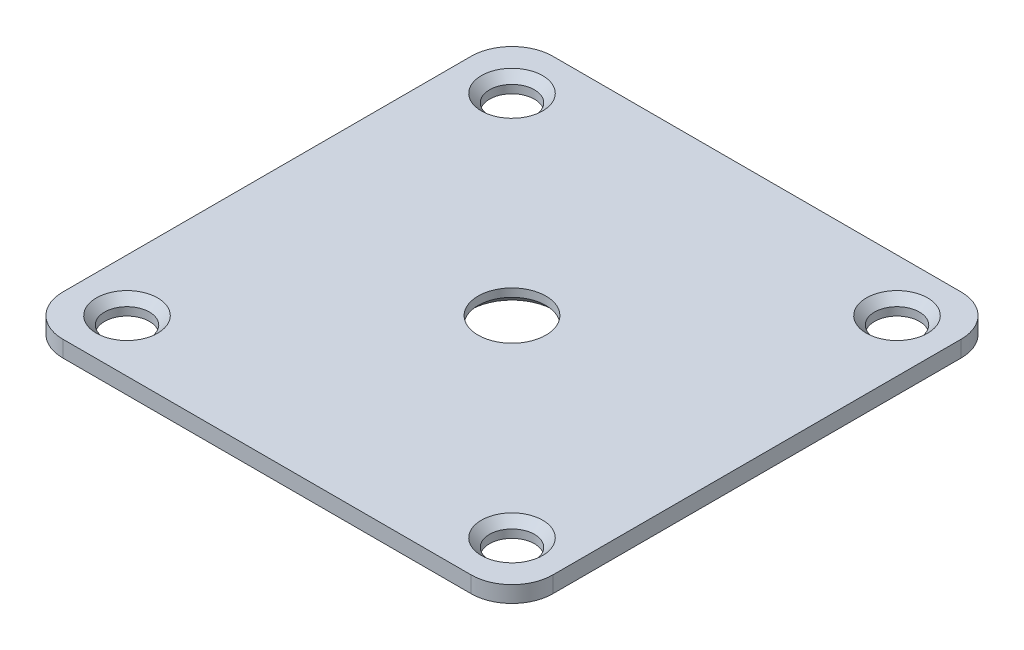
ISO-10303-21;
HEADER;
FILE_DESCRIPTION(('STEP AP214'),'2;1');
FILE_NAME('part.step','',(''),(''),'','','');
FILE_SCHEMA(('AUTOMOTIVE_DESIGN { 1 0 10303 214 1 1 1 1 }'));
ENDSEC;
DATA;
#1=APPLICATION_CONTEXT('core data for automotive mechanical design processes');
#2=APPLICATION_PROTOCOL_DEFINITION('international standard','automotive_design',2000,#1);
#3=PRODUCT_CONTEXT('',#1,'mechanical');
#4=PRODUCT('Part','Part','',(#3));
#5=PRODUCT_RELATED_PRODUCT_CATEGORY('part','',(#4));
#6=PRODUCT_DEFINITION_FORMATION('','',#4);
#7=PRODUCT_DEFINITION_CONTEXT('part definition',#1,'design');
#8=PRODUCT_DEFINITION('design','',#6,#7);
#9=PRODUCT_DEFINITION_SHAPE('','',#8);
#10=(LENGTH_UNIT() NAMED_UNIT(*) SI_UNIT(.MILLI.,.METRE.));
#11=(NAMED_UNIT(*) PLANE_ANGLE_UNIT() SI_UNIT($,.RADIAN.));
#12=(NAMED_UNIT(*) SI_UNIT($,.STERADIAN.) SOLID_ANGLE_UNIT());
#13=UNCERTAINTY_MEASURE_WITH_UNIT(LENGTH_MEASURE(1.E-05),#10,'distance_accuracy_value','');
#14=(GEOMETRIC_REPRESENTATION_CONTEXT(3) GLOBAL_UNCERTAINTY_ASSIGNED_CONTEXT((#13)) GLOBAL_UNIT_ASSIGNED_CONTEXT((#10,
#11,#12)) REPRESENTATION_CONTEXT('',''));
#15=CARTESIAN_POINT('',(0.,0.,0.));
#16=DIRECTION('',(0.,0.,1.));
#17=DIRECTION('',(1.,0.,0.));
#18=AXIS2_PLACEMENT_3D('',#15,#16,#17);
#19=CARTESIAN_POINT('',(30.,2.,0.));
#20=DIRECTION('',(1.,0.,0.));
#21=DIRECTION('',(0.,0.,-1.));
#22=AXIS2_PLACEMENT_3D('',#19,#20,#21);
#23=PLANE('',#22);
#24=DIRECTION('',(0.,0.,1.));
#25=VECTOR('',#24,1.);
#26=CARTESIAN_POINT('',(30.,0.,0.));
#27=LINE('',#26,#25);
#28=CARTESIAN_POINT('',(30.,0.,-25.));
#29=VERTEX_POINT('',#28);
#30=CARTESIAN_POINT('',(30.,0.,25.));
#31=VERTEX_POINT('',#30);
#32=EDGE_CURVE('E140',#29,#31,#27,.T.);
#33=ORIENTED_EDGE('',*,*,#32,.F.);
#34=DIRECTION('',(0.,-1.,0.));
#35=VECTOR('',#34,1.);
#36=CARTESIAN_POINT('',(30.,2.,-25.));
#37=LINE('',#36,#35);
#38=CARTESIAN_POINT('',(30.,2.,-25.));
#39=VERTEX_POINT('',#38);
#40=EDGE_CURVE('E192',#29,#39,#37,.F.);
#41=ORIENTED_EDGE('',*,*,#40,.T.);
#42=DIRECTION('',(0.,0.,1.));
#43=VECTOR('',#42,1.);
#44=CARTESIAN_POINT('',(30.,2.,0.));
#45=LINE('',#44,#43);
#46=CARTESIAN_POINT('',(30.,2.,25.));
#47=VERTEX_POINT('',#46);
#48=EDGE_CURVE('E198',#39,#47,#45,.T.);
#49=ORIENTED_EDGE('',*,*,#48,.T.);
#50=DIRECTION('',(0.,-1.,0.));
#51=VECTOR('',#50,1.);
#52=CARTESIAN_POINT('',(30.,0.,25.));
#53=LINE('',#52,#51);
#54=EDGE_CURVE('E189',#47,#31,#53,.T.);
#55=ORIENTED_EDGE('',*,*,#54,.T.);
#56=EDGE_LOOP('',(#33,#41,#49,#55));
#57=FACE_BOUND('',#56,.T.);
#58=ADVANCED_FACE('F43',(#57),#23,.T.);
#59=CARTESIAN_POINT('',(0.,2.,-30.));
#60=DIRECTION('',(0.,0.,-1.));
#61=DIRECTION('',(-1.,0.,0.));
#62=AXIS2_PLACEMENT_3D('',#59,#60,#61);
#63=PLANE('',#62);
#64=DIRECTION('',(1.,0.,0.));
#65=VECTOR('',#64,1.);
#66=CARTESIAN_POINT('',(0.,0.,-30.));
#67=LINE('',#66,#65);
#68=CARTESIAN_POINT('',(-25.,0.,-30.));
#69=VERTEX_POINT('',#68);
#70=CARTESIAN_POINT('',(25.,0.,-30.));
#71=VERTEX_POINT('',#70);
#72=EDGE_CURVE('E136',#69,#71,#67,.T.);
#73=ORIENTED_EDGE('',*,*,#72,.F.);
#74=DIRECTION('',(0.,-1.,0.));
#75=VECTOR('',#74,1.);
#76=CARTESIAN_POINT('',(-25.,2.,-30.));
#77=LINE('',#76,#75);
#78=CARTESIAN_POINT('',(-25.,2.,-30.));
#79=VERTEX_POINT('',#78);
#80=EDGE_CURVE('E114',#69,#79,#77,.F.);
#81=ORIENTED_EDGE('',*,*,#80,.T.);
#82=DIRECTION('',(1.,0.,0.));
#83=VECTOR('',#82,1.);
#84=CARTESIAN_POINT('',(0.,2.,-30.));
#85=LINE('',#84,#83);
#86=CARTESIAN_POINT('',(25.,2.,-30.));
#87=VERTEX_POINT('',#86);
#88=EDGE_CURVE('E207',#79,#87,#85,.T.);
#89=ORIENTED_EDGE('',*,*,#88,.T.);
#90=DIRECTION('',(0.,-1.,0.));
#91=VECTOR('',#90,1.);
#92=CARTESIAN_POINT('',(25.,2.,-30.));
#93=LINE('',#92,#91);
#94=EDGE_CURVE('E119',#87,#71,#93,.T.);
#95=ORIENTED_EDGE('',*,*,#94,.T.);
#96=EDGE_LOOP('',(#73,#81,#89,#95));
#97=FACE_BOUND('',#96,.T.);
#98=ADVANCED_FACE('F212',(#97),#63,.T.);
#99=CARTESIAN_POINT('',(-30.,2.,0.));
#100=DIRECTION('',(1.,0.,0.));
#101=DIRECTION('',(0.,0.,-1.));
#102=AXIS2_PLACEMENT_3D('',#99,#100,#101);
#103=PLANE('',#102);
#104=DIRECTION('',(0.,0.,1.));
#105=VECTOR('',#104,1.);
#106=CARTESIAN_POINT('',(-30.,2.,0.));
#107=LINE('',#106,#105);
#108=CARTESIAN_POINT('',(-30.,2.,-25.));
#109=VERTEX_POINT('',#108);
#110=CARTESIAN_POINT('',(-30.,2.,25.));
#111=VERTEX_POINT('',#110);
#112=EDGE_CURVE('E128',#109,#111,#107,.T.);
#113=ORIENTED_EDGE('',*,*,#112,.F.);
#114=DIRECTION('',(0.,-1.,0.));
#115=VECTOR('',#114,1.);
#116=CARTESIAN_POINT('',(-30.,0.,-25.));
#117=LINE('',#116,#115);
#118=CARTESIAN_POINT('',(-30.,0.,-25.));
#119=VERTEX_POINT('',#118);
#120=EDGE_CURVE('E113',#109,#119,#117,.T.);
#121=ORIENTED_EDGE('',*,*,#120,.T.);
#122=DIRECTION('',(0.,0.,1.));
#123=VECTOR('',#122,1.);
#124=CARTESIAN_POINT('',(-30.,0.,0.));
#125=LINE('',#124,#123);
#126=CARTESIAN_POINT('',(-30.,0.,25.));
#127=VERTEX_POINT('',#126);
#128=EDGE_CURVE('E126',#119,#127,#125,.T.);
#129=ORIENTED_EDGE('',*,*,#128,.T.);
#130=DIRECTION('',(0.,-1.,0.));
#131=VECTOR('',#130,1.);
#132=CARTESIAN_POINT('',(-30.,2.,25.));
#133=LINE('',#132,#131);
#134=EDGE_CURVE('E130',#127,#111,#133,.F.);
#135=ORIENTED_EDGE('',*,*,#134,.T.);
#136=EDGE_LOOP('',(#113,#121,#129,#135));
#137=FACE_BOUND('',#136,.T.);
#138=ADVANCED_FACE('F125',(#137),#103,.F.);
#139=CARTESIAN_POINT('',(0.,2.,0.));
#140=DIRECTION('',(0.,-1.,0.));
#141=DIRECTION('',(0.,0.,-1.));
#142=AXIS2_PLACEMENT_3D('',#139,#140,#141);
#143=CYLINDRICAL_SURFACE('',#142,4.15000000000004);
#144=CARTESIAN_POINT('',(0.,1.,0.));
#145=DIRECTION('',(0.,1.,0.));
#146=DIRECTION('',(0.,0.,1.));
#147=AXIS2_PLACEMENT_3D('',#144,#145,#146);
#148=CIRCLE('',#147,4.15000000000004);
#149=CARTESIAN_POINT('',(0.,1.,4.15000000000002));
#150=VERTEX_POINT('',#149);
#151=EDGE_CURVE('E172',#150,#150,#148,.F.);
#152=ORIENTED_EDGE('',*,*,#151,.T.);
#153=EDGE_LOOP('',(#152));
#154=FACE_BOUND('',#153,.T.);
#155=CARTESIAN_POINT('',(0.,2.,0.));
#156=DIRECTION('',(0.,1.,0.));
#157=DIRECTION('',(0.,0.,1.));
#158=AXIS2_PLACEMENT_3D('',#155,#156,#157);
#159=CIRCLE('',#158,4.15000000000004);
#160=CARTESIAN_POINT('',(0.,2.,4.15000000000002));
#161=VERTEX_POINT('',#160);
#162=EDGE_CURVE('E138',#161,#161,#159,.T.);
#163=ORIENTED_EDGE('',*,*,#162,.T.);
#164=EDGE_LOOP('',(#163));
#165=FACE_BOUND('',#164,.T.);
#166=ADVANCED_FACE('F232',(#154,#165),#143,.F.);
#167=CARTESIAN_POINT('',(23.57,2.,-23.57));
#168=DIRECTION('',(0.,-1.,0.));
#169=DIRECTION('',(0.,0.,-1.));
#170=AXIS2_PLACEMENT_3D('',#167,#168,#169);
#171=CYLINDRICAL_SURFACE('',#170,2.75);
#172=CARTESIAN_POINT('',(23.57,0.999999999999992,-23.57));
#173=DIRECTION('',(0.,1.,0.));
#174=DIRECTION('',(0.,0.,1.));
#175=AXIS2_PLACEMENT_3D('',#172,#173,#174);
#176=CIRCLE('',#175,2.75);
#177=CARTESIAN_POINT('',(23.57,0.999999999999992,-20.82));
#178=VERTEX_POINT('',#177);
#179=EDGE_CURVE('E144',#178,#178,#176,.T.);
#180=ORIENTED_EDGE('',*,*,#179,.T.);
#181=EDGE_LOOP('',(#180));
#182=FACE_BOUND('',#181,.T.);
#183=CARTESIAN_POINT('',(23.57,0.,-23.57));
#184=DIRECTION('',(0.,1.,0.));
#185=DIRECTION('',(0.,0.,1.));
#186=AXIS2_PLACEMENT_3D('',#183,#184,#185);
#187=CIRCLE('',#186,2.75);
#188=CARTESIAN_POINT('',(23.57,0.,-20.82));
#189=VERTEX_POINT('',#188);
#190=EDGE_CURVE('E213',#189,#189,#187,.T.);
#191=ORIENTED_EDGE('',*,*,#190,.F.);
#192=EDGE_LOOP('',(#191));
#193=FACE_BOUND('',#192,.T.);
#194=ADVANCED_FACE('F259',(#182,#193),#171,.F.);
#195=CARTESIAN_POINT('',(-23.57,2.,-23.57));
#196=DIRECTION('',(0.,-1.,0.));
#197=DIRECTION('',(0.,0.,-1.));
#198=AXIS2_PLACEMENT_3D('',#195,#196,#197);
#199=CYLINDRICAL_SURFACE('',#198,2.75);
#200=CARTESIAN_POINT('',(-23.57,0.999999999999992,-23.57));
#201=DIRECTION('',(0.,1.,0.));
#202=DIRECTION('',(0.,0.,1.));
#203=AXIS2_PLACEMENT_3D('',#200,#201,#202);
#204=CIRCLE('',#203,2.75);
#205=CARTESIAN_POINT('',(-23.57,0.999999999999992,-20.82));
#206=VERTEX_POINT('',#205);
#207=EDGE_CURVE('E166',#206,#206,#204,.T.);
#208=ORIENTED_EDGE('',*,*,#207,.T.);
#209=EDGE_LOOP('',(#208));
#210=FACE_BOUND('',#209,.T.);
#211=CARTESIAN_POINT('',(-23.57,0.,-23.57));
#212=DIRECTION('',(0.,1.,0.));
#213=DIRECTION('',(0.,0.,1.));
#214=AXIS2_PLACEMENT_3D('',#211,#212,#213);
#215=CIRCLE('',#214,2.75);
#216=CARTESIAN_POINT('',(-23.57,0.,-20.82));
#217=VERTEX_POINT('',#216);
#218=EDGE_CURVE('E215',#217,#217,#215,.T.);
#219=ORIENTED_EDGE('',*,*,#218,.F.);
#220=EDGE_LOOP('',(#219));
#221=FACE_BOUND('',#220,.T.);
#222=ADVANCED_FACE('F263',(#210,#221),#199,.F.);
#223=CARTESIAN_POINT('',(-23.57,2.,23.57));
#224=DIRECTION('',(0.,-1.,0.));
#225=DIRECTION('',(0.,0.,-1.));
#226=AXIS2_PLACEMENT_3D('',#223,#224,#225);
#227=CYLINDRICAL_SURFACE('',#226,2.75);
#228=CARTESIAN_POINT('',(-23.57,0.999999999999992,23.57));
#229=DIRECTION('',(0.,1.,0.));
#230=DIRECTION('',(0.,0.,1.));
#231=AXIS2_PLACEMENT_3D('',#228,#229,#230);
#232=CIRCLE('',#231,2.75);
#233=CARTESIAN_POINT('',(-23.57,0.999999999999992,26.32));
#234=VERTEX_POINT('',#233);
#235=EDGE_CURVE('E163',#234,#234,#232,.T.);
#236=ORIENTED_EDGE('',*,*,#235,.T.);
#237=EDGE_LOOP('',(#236));
#238=FACE_BOUND('',#237,.T.);
#239=CARTESIAN_POINT('',(-23.57,0.,23.57));
#240=DIRECTION('',(0.,1.,0.));
#241=DIRECTION('',(0.,0.,1.));
#242=AXIS2_PLACEMENT_3D('',#239,#240,#241);
#243=CIRCLE('',#242,2.75);
#244=CARTESIAN_POINT('',(-23.57,0.,26.32));
#245=VERTEX_POINT('',#244);
#246=EDGE_CURVE('E220',#245,#245,#243,.T.);
#247=ORIENTED_EDGE('',*,*,#246,.F.);
#248=EDGE_LOOP('',(#247));
#249=FACE_BOUND('',#248,.T.);
#250=ADVANCED_FACE('F267',(#238,#249),#227,.F.);
#251=CARTESIAN_POINT('',(23.57,2.,23.57));
#252=DIRECTION('',(0.,-1.,0.));
#253=DIRECTION('',(0.,0.,-1.));
#254=AXIS2_PLACEMENT_3D('',#251,#252,#253);
#255=CYLINDRICAL_SURFACE('',#254,2.75);
#256=CARTESIAN_POINT('',(23.57,0.999999999999992,23.57));
#257=DIRECTION('',(0.,1.,0.));
#258=DIRECTION('',(0.,0.,1.));
#259=AXIS2_PLACEMENT_3D('',#256,#257,#258);
#260=CIRCLE('',#259,2.75);
#261=CARTESIAN_POINT('',(23.57,0.999999999999992,26.32));
#262=VERTEX_POINT('',#261);
#263=EDGE_CURVE('E160',#262,#262,#260,.T.);
#264=ORIENTED_EDGE('',*,*,#263,.T.);
#265=EDGE_LOOP('',(#264));
#266=FACE_BOUND('',#265,.T.);
#267=CARTESIAN_POINT('',(23.57,0.,23.57));
#268=DIRECTION('',(0.,1.,0.));
#269=DIRECTION('',(0.,0.,1.));
#270=AXIS2_PLACEMENT_3D('',#267,#268,#269);
#271=CIRCLE('',#270,2.75);
#272=CARTESIAN_POINT('',(23.57,0.,26.32));
#273=VERTEX_POINT('',#272);
#274=EDGE_CURVE('E223',#273,#273,#271,.T.);
#275=ORIENTED_EDGE('',*,*,#274,.F.);
#276=EDGE_LOOP('',(#275));
#277=FACE_BOUND('',#276,.T.);
#278=ADVANCED_FACE('F245',(#266,#277),#255,.F.);
#279=CARTESIAN_POINT('',(0.,2.,30.));
#280=DIRECTION('',(0.,0.,-1.));
#281=DIRECTION('',(-1.,0.,0.));
#282=AXIS2_PLACEMENT_3D('',#279,#280,#281);
#283=PLANE('',#282);
#284=DIRECTION('',(1.,0.,0.));
#285=VECTOR('',#284,1.);
#286=CARTESIAN_POINT('',(0.,2.,30.));
#287=LINE('',#286,#285);
#288=CARTESIAN_POINT('',(-25.,2.,30.));
#289=VERTEX_POINT('',#288);
#290=CARTESIAN_POINT('',(25.,2.,30.));
#291=VERTEX_POINT('',#290);
#292=EDGE_CURVE('E148',#289,#291,#287,.T.);
#293=ORIENTED_EDGE('',*,*,#292,.F.);
#294=DIRECTION('',(0.,-1.,0.));
#295=VECTOR('',#294,1.);
#296=CARTESIAN_POINT('',(-25.,2.,30.));
#297=LINE('',#296,#295);
#298=CARTESIAN_POINT('',(-25.,0.,30.));
#299=VERTEX_POINT('',#298);
#300=EDGE_CURVE('E11',#289,#299,#297,.T.);
#301=ORIENTED_EDGE('',*,*,#300,.T.);
#302=DIRECTION('',(1.,0.,0.));
#303=VECTOR('',#302,1.);
#304=CARTESIAN_POINT('',(0.,0.,30.));
#305=LINE('',#304,#303);
#306=CARTESIAN_POINT('',(25.,0.,30.));
#307=VERTEX_POINT('',#306);
#308=EDGE_CURVE('E135',#299,#307,#305,.T.);
#309=ORIENTED_EDGE('',*,*,#308,.T.);
#310=DIRECTION('',(0.,-1.,0.));
#311=VECTOR('',#310,1.);
#312=CARTESIAN_POINT('',(25.,2.,30.));
#313=LINE('',#312,#311);
#314=EDGE_CURVE('E51',#307,#291,#313,.F.);
#315=ORIENTED_EDGE('',*,*,#314,.T.);
#316=EDGE_LOOP('',(#293,#301,#309,#315));
#317=FACE_BOUND('',#316,.T.);
#318=ADVANCED_FACE('F235',(#317),#283,.F.);
#319=CARTESIAN_POINT('',(0.,2.,0.));
#320=DIRECTION('',(0.,1.,0.));
#321=DIRECTION('',(0.,0.,1.));
#322=AXIS2_PLACEMENT_3D('',#319,#320,#321);
#323=PLANE('',#322);
#324=CARTESIAN_POINT('',(23.57,2.,-23.57));
#325=DIRECTION('',(0.,1.,0.));
#326=DIRECTION('',(0.,0.,1.));
#327=AXIS2_PLACEMENT_3D('',#324,#325,#326);
#328=CIRCLE('',#327,3.75000000000001);
#329=CARTESIAN_POINT('',(23.57,2.,-19.82));
#330=VERTEX_POINT('',#329);
#331=EDGE_CURVE('E157',#330,#330,#328,.F.);
#332=ORIENTED_EDGE('',*,*,#331,.T.);
#333=EDGE_LOOP('',(#332));
#334=FACE_BOUND('',#333,.T.);
#335=CARTESIAN_POINT('',(23.57,2.,23.57));
#336=DIRECTION('',(0.,1.,0.));
#337=DIRECTION('',(0.,0.,1.));
#338=AXIS2_PLACEMENT_3D('',#335,#336,#337);
#339=CIRCLE('',#338,3.75000000000001);
#340=CARTESIAN_POINT('',(23.57,2.,27.32));
#341=VERTEX_POINT('',#340);
#342=EDGE_CURVE('E154',#341,#341,#339,.F.);
#343=ORIENTED_EDGE('',*,*,#342,.T.);
#344=EDGE_LOOP('',(#343));
#345=FACE_BOUND('',#344,.T.);
#346=CARTESIAN_POINT('',(-23.57,2.,23.57));
#347=DIRECTION('',(0.,1.,0.));
#348=DIRECTION('',(0.,0.,1.));
#349=AXIS2_PLACEMENT_3D('',#346,#347,#348);
#350=CIRCLE('',#349,3.75000000000001);
#351=CARTESIAN_POINT('',(-23.57,2.,27.32));
#352=VERTEX_POINT('',#351);
#353=EDGE_CURVE('E151',#352,#352,#350,.F.);
#354=ORIENTED_EDGE('',*,*,#353,.T.);
#355=EDGE_LOOP('',(#354));
#356=FACE_BOUND('',#355,.T.);
#357=CARTESIAN_POINT('',(-23.57,2.,-23.57));
#358=DIRECTION('',(0.,1.,0.));
#359=DIRECTION('',(0.,0.,1.));
#360=AXIS2_PLACEMENT_3D('',#357,#358,#359);
#361=CIRCLE('',#360,3.75000000000001);
#362=CARTESIAN_POINT('',(-23.57,2.,-19.82));
#363=VERTEX_POINT('',#362);
#364=EDGE_CURVE('E147',#363,#363,#361,.F.);
#365=ORIENTED_EDGE('',*,*,#364,.T.);
#366=EDGE_LOOP('',(#365));
#367=FACE_BOUND('',#366,.T.);
#368=ORIENTED_EDGE('',*,*,#162,.F.);
#369=EDGE_LOOP('',(#368));
#370=FACE_BOUND('',#369,.T.);
#371=ORIENTED_EDGE('',*,*,#88,.F.);
#372=CARTESIAN_POINT('',(-25.,2.,-25.));
#373=DIRECTION('',(0.,1.,0.));
#374=DIRECTION('',(0.,0.,1.));
#375=AXIS2_PLACEMENT_3D('',#372,#373,#374);
#376=CIRCLE('',#375,5.);
#377=EDGE_CURVE('E187',#79,#109,#376,.T.);
#378=ORIENTED_EDGE('',*,*,#377,.T.);
#379=ORIENTED_EDGE('',*,*,#112,.T.);
#380=CARTESIAN_POINT('',(-25.,2.,25.));
#381=DIRECTION('',(0.,1.,0.));
#382=DIRECTION('',(0.,0.,1.));
#383=AXIS2_PLACEMENT_3D('',#380,#381,#382);
#384=CIRCLE('',#383,5.);
#385=EDGE_CURVE('E64',#111,#289,#384,.T.);
#386=ORIENTED_EDGE('',*,*,#385,.T.);
#387=ORIENTED_EDGE('',*,*,#292,.T.);
#388=CARTESIAN_POINT('',(25.,2.,25.));
#389=DIRECTION('',(0.,1.,0.));
#390=DIRECTION('',(0.,0.,1.));
#391=AXIS2_PLACEMENT_3D('',#388,#389,#390);
#392=CIRCLE('',#391,5.);
#393=EDGE_CURVE('E182',#291,#47,#392,.T.);
#394=ORIENTED_EDGE('',*,*,#393,.T.);
#395=ORIENTED_EDGE('',*,*,#48,.F.);
#396=CARTESIAN_POINT('',(25.,2.,-25.));
#397=DIRECTION('',(0.,1.,0.));
#398=DIRECTION('',(0.,0.,1.));
#399=AXIS2_PLACEMENT_3D('',#396,#397,#398);
#400=CIRCLE('',#399,5.);
#401=EDGE_CURVE('E185',#39,#87,#400,.T.);
#402=ORIENTED_EDGE('',*,*,#401,.T.);
#403=EDGE_LOOP('',(#371,#378,#379,#386,#387,#394,#395,#402));
#404=FACE_BOUND('',#403,.T.);
#405=ADVANCED_FACE('F204',(#334,#345,#356,#367,#370,#404),#323,.T.);
#406=CARTESIAN_POINT('',(0.,0.,0.));
#407=DIRECTION('',(0.,1.,0.));
#408=DIRECTION('',(0.,0.,1.));
#409=AXIS2_PLACEMENT_3D('',#406,#407,#408);
#410=PLANE('',#409);
#411=CARTESIAN_POINT('',(0.,0.,0.));
#412=DIRECTION('',(0.,1.,0.));
#413=DIRECTION('',(0.,0.,1.));
#414=AXIS2_PLACEMENT_3D('',#411,#412,#413);
#415=CIRCLE('',#414,5.15000000000004);
#416=CARTESIAN_POINT('',(0.,0.,5.15000000000002));
#417=VERTEX_POINT('',#416);
#418=EDGE_CURVE('E169',#417,#417,#415,.T.);
#419=ORIENTED_EDGE('',*,*,#418,.T.);
#420=EDGE_LOOP('',(#419));
#421=FACE_BOUND('',#420,.T.);
#422=ORIENTED_EDGE('',*,*,#274,.T.);
#423=EDGE_LOOP('',(#422));
#424=FACE_BOUND('',#423,.T.);
#425=ORIENTED_EDGE('',*,*,#246,.T.);
#426=EDGE_LOOP('',(#425));
#427=FACE_BOUND('',#426,.T.);
#428=ORIENTED_EDGE('',*,*,#218,.T.);
#429=EDGE_LOOP('',(#428));
#430=FACE_BOUND('',#429,.T.);
#431=ORIENTED_EDGE('',*,*,#190,.T.);
#432=EDGE_LOOP('',(#431));
#433=FACE_BOUND('',#432,.T.);
#434=ORIENTED_EDGE('',*,*,#128,.F.);
#435=CARTESIAN_POINT('',(-25.,0.,-25.));
#436=DIRECTION('',(0.,1.,0.));
#437=DIRECTION('',(0.,0.,1.));
#438=AXIS2_PLACEMENT_3D('',#435,#436,#437);
#439=CIRCLE('',#438,5.);
#440=EDGE_CURVE('E109',#119,#69,#439,.F.);
#441=ORIENTED_EDGE('',*,*,#440,.T.);
#442=ORIENTED_EDGE('',*,*,#72,.T.);
#443=CARTESIAN_POINT('',(25.,0.,-25.));
#444=DIRECTION('',(0.,1.,0.));
#445=DIRECTION('',(0.,0.,1.));
#446=AXIS2_PLACEMENT_3D('',#443,#444,#445);
#447=CIRCLE('',#446,5.);
#448=EDGE_CURVE('E120',#71,#29,#447,.F.);
#449=ORIENTED_EDGE('',*,*,#448,.T.);
#450=ORIENTED_EDGE('',*,*,#32,.T.);
#451=CARTESIAN_POINT('',(25.,0.,25.));
#452=DIRECTION('',(0.,1.,0.));
#453=DIRECTION('',(0.,0.,1.));
#454=AXIS2_PLACEMENT_3D('',#451,#452,#453);
#455=CIRCLE('',#454,5.);
#456=EDGE_CURVE('E129',#31,#307,#455,.F.);
#457=ORIENTED_EDGE('',*,*,#456,.T.);
#458=ORIENTED_EDGE('',*,*,#308,.F.);
#459=CARTESIAN_POINT('',(-25.,0.,25.));
#460=DIRECTION('',(0.,1.,0.));
#461=DIRECTION('',(0.,0.,1.));
#462=AXIS2_PLACEMENT_3D('',#459,#460,#461);
#463=CIRCLE('',#462,5.);
#464=EDGE_CURVE('E134',#299,#127,#463,.F.);
#465=ORIENTED_EDGE('',*,*,#464,.T.);
#466=EDGE_LOOP('',(#434,#441,#442,#449,#450,#457,#458,#465));
#467=FACE_BOUND('',#466,.T.);
#468=ADVANCED_FACE('F132',(#421,#424,#427,#430,#433,#467),#410,.F.);
#469=CARTESIAN_POINT('',(23.57,0.999999999999992,-23.57));
#470=DIRECTION('',(0.,1.,0.));
#471=DIRECTION('',(0.,0.,1.));
#472=AXIS2_PLACEMENT_3D('',#469,#470,#471);
#473=CONICAL_SURFACE('',#472,2.75,0.78539816339745);
#474=ORIENTED_EDGE('',*,*,#331,.F.);
#475=EDGE_LOOP('',(#474));
#476=FACE_BOUND('',#475,.T.);
#477=ORIENTED_EDGE('',*,*,#179,.F.);
#478=EDGE_LOOP('',(#477));
#479=FACE_BOUND('',#478,.T.);
#480=ADVANCED_FACE('F242',(#476,#479),#473,.F.);
#481=CARTESIAN_POINT('',(23.57,0.999999999999992,23.57));
#482=DIRECTION('',(0.,1.,0.));
#483=DIRECTION('',(0.,0.,1.));
#484=AXIS2_PLACEMENT_3D('',#481,#482,#483);
#485=CONICAL_SURFACE('',#484,2.75,0.78539816339745);
#486=ORIENTED_EDGE('',*,*,#342,.F.);
#487=EDGE_LOOP('',(#486));
#488=FACE_BOUND('',#487,.T.);
#489=ORIENTED_EDGE('',*,*,#263,.F.);
#490=EDGE_LOOP('',(#489));
#491=FACE_BOUND('',#490,.T.);
#492=ADVANCED_FACE('F281',(#488,#491),#485,.F.);
#493=CARTESIAN_POINT('',(-23.57,0.999999999999992,23.57));
#494=DIRECTION('',(0.,1.,0.));
#495=DIRECTION('',(0.,0.,1.));
#496=AXIS2_PLACEMENT_3D('',#493,#494,#495);
#497=CONICAL_SURFACE('',#496,2.75,0.78539816339745);
#498=ORIENTED_EDGE('',*,*,#353,.F.);
#499=EDGE_LOOP('',(#498));
#500=FACE_BOUND('',#499,.T.);
#501=ORIENTED_EDGE('',*,*,#235,.F.);
#502=EDGE_LOOP('',(#501));
#503=FACE_BOUND('',#502,.T.);
#504=ADVANCED_FACE('F288',(#500,#503),#497,.F.);
#505=CARTESIAN_POINT('',(-23.57,0.999999999999992,-23.57));
#506=DIRECTION('',(0.,1.,0.));
#507=DIRECTION('',(0.,0.,1.));
#508=AXIS2_PLACEMENT_3D('',#505,#506,#507);
#509=CONICAL_SURFACE('',#508,2.75,0.78539816339745);
#510=ORIENTED_EDGE('',*,*,#364,.F.);
#511=EDGE_LOOP('',(#510));
#512=FACE_BOUND('',#511,.T.);
#513=ORIENTED_EDGE('',*,*,#207,.F.);
#514=EDGE_LOOP('',(#513));
#515=FACE_BOUND('',#514,.T.);
#516=ADVANCED_FACE('F295',(#512,#515),#509,.F.);
#517=CARTESIAN_POINT('',(0.,0.,0.));
#518=DIRECTION('',(0.,-1.,0.));
#519=DIRECTION('',(0.,0.,-1.));
#520=AXIS2_PLACEMENT_3D('',#517,#518,#519);
#521=CONICAL_SURFACE('',#520,5.15000000000004,0.785398163397449);
#522=ORIENTED_EDGE('',*,*,#151,.F.);
#523=EDGE_LOOP('',(#522));
#524=FACE_BOUND('',#523,.T.);
#525=ORIENTED_EDGE('',*,*,#418,.F.);
#526=EDGE_LOOP('',(#525));
#527=FACE_BOUND('',#526,.T.);
#528=ADVANCED_FACE('F302',(#524,#527),#521,.F.);
#529=CARTESIAN_POINT('',(-25.,2.,-25.));
#530=DIRECTION('',(0.,1.,0.));
#531=DIRECTION('',(0.,0.,1.));
#532=AXIS2_PLACEMENT_3D('',#529,#530,#531);
#533=CYLINDRICAL_SURFACE('',#532,5.);
#534=ORIENTED_EDGE('',*,*,#377,.F.);
#535=ORIENTED_EDGE('',*,*,#80,.F.);
#536=ORIENTED_EDGE('',*,*,#440,.F.);
#537=ORIENTED_EDGE('',*,*,#120,.F.);
#538=EDGE_LOOP('',(#534,#535,#536,#537));
#539=FACE_BOUND('',#538,.T.);
#540=ADVANCED_FACE('F112',(#539),#533,.T.);
#541=CARTESIAN_POINT('',(25.,2.,-25.));
#542=DIRECTION('',(0.,-1.,0.));
#543=DIRECTION('',(0.,0.,-1.));
#544=AXIS2_PLACEMENT_3D('',#541,#542,#543);
#545=CYLINDRICAL_SURFACE('',#544,5.);
#546=ORIENTED_EDGE('',*,*,#401,.F.);
#547=ORIENTED_EDGE('',*,*,#40,.F.);
#548=ORIENTED_EDGE('',*,*,#448,.F.);
#549=ORIENTED_EDGE('',*,*,#94,.F.);
#550=EDGE_LOOP('',(#546,#547,#548,#549));
#551=FACE_BOUND('',#550,.T.);
#552=ADVANCED_FACE('F210',(#551),#545,.T.);
#553=CARTESIAN_POINT('',(-25.,2.,25.));
#554=DIRECTION('',(0.,-1.,0.));
#555=DIRECTION('',(0.,0.,-1.));
#556=AXIS2_PLACEMENT_3D('',#553,#554,#555);
#557=CYLINDRICAL_SURFACE('',#556,5.);
#558=ORIENTED_EDGE('',*,*,#385,.F.);
#559=ORIENTED_EDGE('',*,*,#134,.F.);
#560=ORIENTED_EDGE('',*,*,#464,.F.);
#561=ORIENTED_EDGE('',*,*,#300,.F.);
#562=EDGE_LOOP('',(#558,#559,#560,#561));
#563=FACE_BOUND('',#562,.T.);
#564=ADVANCED_FACE('F311',(#563),#557,.T.);
#565=CARTESIAN_POINT('',(25.,2.,25.));
#566=DIRECTION('',(0.,1.,0.));
#567=DIRECTION('',(0.,0.,1.));
#568=AXIS2_PLACEMENT_3D('',#565,#566,#567);
#569=CYLINDRICAL_SURFACE('',#568,5.);
#570=ORIENTED_EDGE('',*,*,#393,.F.);
#571=ORIENTED_EDGE('',*,*,#314,.F.);
#572=ORIENTED_EDGE('',*,*,#456,.F.);
#573=ORIENTED_EDGE('',*,*,#54,.F.);
#574=EDGE_LOOP('',(#570,#571,#572,#573));
#575=FACE_BOUND('',#574,.T.);
#576=ADVANCED_FACE('F45',(#575),#569,.T.);
#577=CLOSED_SHELL('',(#58,#98,#138,#166,#194,#222,#250,#278,#318,#405,#468,#480,#492,#504,#516,
#528,#540,#552,#564,#576));
#578=MANIFOLD_SOLID_BREP('B2',#577);
#579=ADVANCED_BREP_SHAPE_REPRESENTATION('',(#18,#578),#14);
#580=SHAPE_DEFINITION_REPRESENTATION(#9,#579);
ENDSEC;
END-ISO-10303-21;
